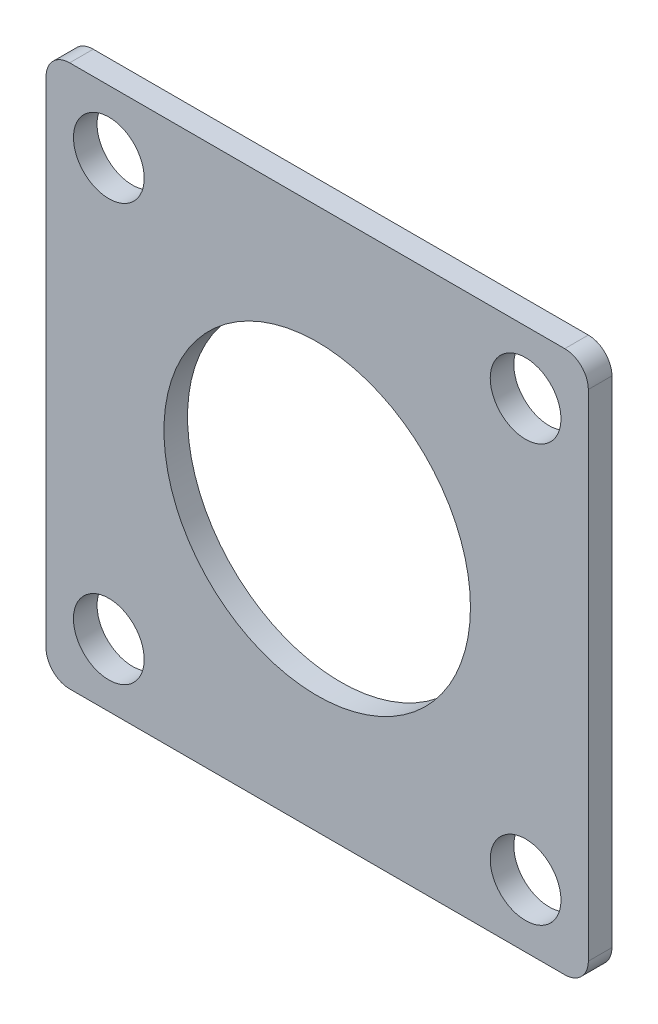
ISO-10303-21;
HEADER;
FILE_DESCRIPTION(('STEP AP214'),'2;1');
FILE_NAME('part.step','',(''),(''),'','','');
FILE_SCHEMA(('AUTOMOTIVE_DESIGN { 1 0 10303 214 1 1 1 1 }'));
ENDSEC;
DATA;
#1=APPLICATION_CONTEXT('core data for automotive mechanical design processes');
#2=APPLICATION_PROTOCOL_DEFINITION('international standard','automotive_design',2000,#1);
#3=PRODUCT_CONTEXT('',#1,'mechanical');
#4=PRODUCT('Part','Part','',(#3));
#5=PRODUCT_RELATED_PRODUCT_CATEGORY('part','',(#4));
#6=PRODUCT_DEFINITION_FORMATION('','',#4);
#7=PRODUCT_DEFINITION_CONTEXT('part definition',#1,'design');
#8=PRODUCT_DEFINITION('design','',#6,#7);
#9=PRODUCT_DEFINITION_SHAPE('','',#8);
#10=(LENGTH_UNIT() NAMED_UNIT(*) SI_UNIT(.MILLI.,.METRE.));
#11=(NAMED_UNIT(*) PLANE_ANGLE_UNIT() SI_UNIT($,.RADIAN.));
#12=(NAMED_UNIT(*) SI_UNIT($,.STERADIAN.) SOLID_ANGLE_UNIT());
#13=UNCERTAINTY_MEASURE_WITH_UNIT(LENGTH_MEASURE(1.E-05),#10,'distance_accuracy_value','');
#14=(GEOMETRIC_REPRESENTATION_CONTEXT(3) GLOBAL_UNCERTAINTY_ASSIGNED_CONTEXT((#13)) GLOBAL_UNIT_ASSIGNED_CONTEXT((#10,
#11,#12)) REPRESENTATION_CONTEXT('',''));
#15=CARTESIAN_POINT('',(0.,0.,0.));
#16=DIRECTION('',(0.,0.,1.));
#17=DIRECTION('',(1.,0.,0.));
#18=AXIS2_PLACEMENT_3D('',#15,#16,#17);
#19=CARTESIAN_POINT('',(-11.5,-11.5,1.));
#20=DIRECTION('',(0.,0.,1.));
#21=DIRECTION('',(1.,0.,0.));
#22=AXIS2_PLACEMENT_3D('',#19,#20,#21);
#23=PLANE('',#22);
#24=CARTESIAN_POINT('',(8.83883476483185,8.83883476483184,1.));
#25=DIRECTION('',(0.,0.,1.));
#26=DIRECTION('',(-1.,0.,0.));
#27=AXIS2_PLACEMENT_3D('',#24,#25,#26);
#28=CIRCLE('',#27,1.5);
#29=CARTESIAN_POINT('',(7.33883476483185,8.83883476483184,1.));
#30=VERTEX_POINT('',#29);
#31=EDGE_CURVE('E209',#30,#30,#28,.T.);
#32=ORIENTED_EDGE('',*,*,#31,.F.);
#33=EDGE_LOOP('',(#32));
#34=FACE_BOUND('',#33,.T.);
#35=CARTESIAN_POINT('',(-8.83883476483185,-8.83883476483184,1.));
#36=DIRECTION('',(0.,0.,1.));
#37=DIRECTION('',(-1.,0.,0.));
#38=AXIS2_PLACEMENT_3D('',#35,#36,#37);
#39=CIRCLE('',#38,1.5);
#40=CARTESIAN_POINT('',(-10.3388347648318,-8.83883476483184,1.));
#41=VERTEX_POINT('',#40);
#42=EDGE_CURVE('E226',#41,#41,#39,.T.);
#43=ORIENTED_EDGE('',*,*,#42,.F.);
#44=EDGE_LOOP('',(#43));
#45=FACE_BOUND('',#44,.T.);
#46=DIRECTION('',(0.,-1.,0.));
#47=VECTOR('',#46,1.);
#48=CARTESIAN_POINT('',(-11.5,11.5,1.));
#49=LINE('',#48,#47);
#50=CARTESIAN_POINT('',(-11.5,10.5,1.));
#51=VERTEX_POINT('',#50);
#52=CARTESIAN_POINT('',(-11.5,-10.5,1.));
#53=VERTEX_POINT('',#52);
#54=EDGE_CURVE('E165',#51,#53,#49,.T.);
#55=ORIENTED_EDGE('',*,*,#54,.T.);
#56=CARTESIAN_POINT('',(-10.5,-10.5,1.));
#57=DIRECTION('',(0.,0.,1.));
#58=DIRECTION('',(1.,0.,0.));
#59=AXIS2_PLACEMENT_3D('',#56,#57,#58);
#60=CIRCLE('',#59,1.);
#61=CARTESIAN_POINT('',(-10.5,-11.5,1.));
#62=VERTEX_POINT('',#61);
#63=EDGE_CURVE('E189',#53,#62,#60,.T.);
#64=ORIENTED_EDGE('',*,*,#63,.T.);
#65=DIRECTION('',(1.,0.,0.));
#66=VECTOR('',#65,1.);
#67=CARTESIAN_POINT('',(-11.5,-11.5,1.));
#68=LINE('',#67,#66);
#69=CARTESIAN_POINT('',(10.5,-11.5,1.));
#70=VERTEX_POINT('',#69);
#71=EDGE_CURVE('E140',#62,#70,#68,.T.);
#72=ORIENTED_EDGE('',*,*,#71,.T.);
#73=CARTESIAN_POINT('',(10.5,-10.5,1.));
#74=DIRECTION('',(0.,0.,1.));
#75=DIRECTION('',(1.,0.,0.));
#76=AXIS2_PLACEMENT_3D('',#73,#74,#75);
#77=CIRCLE('',#76,1.);
#78=CARTESIAN_POINT('',(11.5,-10.5,1.));
#79=VERTEX_POINT('',#78);
#80=EDGE_CURVE('E186',#70,#79,#77,.T.);
#81=ORIENTED_EDGE('',*,*,#80,.T.);
#82=DIRECTION('',(0.,1.,0.));
#83=VECTOR('',#82,1.);
#84=CARTESIAN_POINT('',(11.5,11.5,1.));
#85=LINE('',#84,#83);
#86=CARTESIAN_POINT('',(11.5,10.5,1.));
#87=VERTEX_POINT('',#86);
#88=EDGE_CURVE('E203',#79,#87,#85,.T.);
#89=ORIENTED_EDGE('',*,*,#88,.T.);
#90=CARTESIAN_POINT('',(10.5,10.5,1.));
#91=DIRECTION('',(0.,0.,1.));
#92=DIRECTION('',(1.,0.,0.));
#93=AXIS2_PLACEMENT_3D('',#90,#91,#92);
#94=CIRCLE('',#93,1.);
#95=CARTESIAN_POINT('',(10.5,11.5,1.));
#96=VERTEX_POINT('',#95);
#97=EDGE_CURVE('E63',#87,#96,#94,.T.);
#98=ORIENTED_EDGE('',*,*,#97,.T.);
#99=DIRECTION('',(-1.,0.,0.));
#100=VECTOR('',#99,1.);
#101=CARTESIAN_POINT('',(-11.5,11.5,1.));
#102=LINE('',#101,#100);
#103=CARTESIAN_POINT('',(-10.5,11.5,1.));
#104=VERTEX_POINT('',#103);
#105=EDGE_CURVE('E167',#96,#104,#102,.T.);
#106=ORIENTED_EDGE('',*,*,#105,.T.);
#107=CARTESIAN_POINT('',(-10.5,10.5,1.));
#108=DIRECTION('',(0.,0.,1.));
#109=DIRECTION('',(1.,0.,0.));
#110=AXIS2_PLACEMENT_3D('',#107,#108,#109);
#111=CIRCLE('',#110,1.);
#112=EDGE_CURVE('E181',#104,#51,#111,.T.);
#113=ORIENTED_EDGE('',*,*,#112,.T.);
#114=EDGE_LOOP('',(#55,#64,#72,#81,#89,#98,#106,#113));
#115=FACE_BOUND('',#114,.T.);
#116=CARTESIAN_POINT('',(-8.83883476483185,8.83883476483184,1.));
#117=DIRECTION('',(0.,0.,1.));
#118=DIRECTION('',(1.,0.,0.));
#119=AXIS2_PLACEMENT_3D('',#116,#117,#118);
#120=CIRCLE('',#119,1.5);
#121=CARTESIAN_POINT('',(-7.33883476483185,8.83883476483184,1.));
#122=VERTEX_POINT('',#121);
#123=EDGE_CURVE('E159',#122,#122,#120,.T.);
#124=ORIENTED_EDGE('',*,*,#123,.F.);
#125=EDGE_LOOP('',(#124));
#126=FACE_BOUND('',#125,.T.);
#127=CARTESIAN_POINT('',(8.83883476483185,-8.83883476483184,1.));
#128=DIRECTION('',(0.,0.,1.));
#129=DIRECTION('',(1.,0.,0.));
#130=AXIS2_PLACEMENT_3D('',#127,#128,#129);
#131=CIRCLE('',#130,1.5);
#132=CARTESIAN_POINT('',(10.3388347648318,-8.83883476483184,1.));
#133=VERTEX_POINT('',#132);
#134=EDGE_CURVE('E200',#133,#133,#131,.T.);
#135=ORIENTED_EDGE('',*,*,#134,.F.);
#136=EDGE_LOOP('',(#135));
#137=FACE_BOUND('',#136,.T.);
#138=CARTESIAN_POINT('',(0.,0.,1.));
#139=DIRECTION('',(0.,0.,1.));
#140=DIRECTION('',(1.,0.,0.));
#141=AXIS2_PLACEMENT_3D('',#138,#139,#140);
#142=CIRCLE('',#141,6.5);
#143=CARTESIAN_POINT('',(6.5,0.,1.));
#144=VERTEX_POINT('',#143);
#145=EDGE_CURVE('E210',#144,#144,#142,.T.);
#146=ORIENTED_EDGE('',*,*,#145,.F.);
#147=EDGE_LOOP('',(#146));
#148=FACE_BOUND('',#147,.T.);
#149=ADVANCED_FACE('F36',(#34,#45,#115,#126,#137,#148),#23,.T.);
#150=CARTESIAN_POINT('',(-11.5,-11.5,0.));
#151=DIRECTION('',(0.,0.,1.));
#152=DIRECTION('',(1.,0.,0.));
#153=AXIS2_PLACEMENT_3D('',#150,#151,#152);
#154=PLANE('',#153);
#155=CARTESIAN_POINT('',(8.83883476483185,8.83883476483184,0.));
#156=DIRECTION('',(0.,0.,1.));
#157=DIRECTION('',(-1.,0.,0.));
#158=AXIS2_PLACEMENT_3D('',#155,#156,#157);
#159=CIRCLE('',#158,1.5);
#160=CARTESIAN_POINT('',(7.33883476483185,8.83883476483184,0.));
#161=VERTEX_POINT('',#160);
#162=EDGE_CURVE('E206',#161,#161,#159,.T.);
#163=ORIENTED_EDGE('',*,*,#162,.T.);
#164=EDGE_LOOP('',(#163));
#165=FACE_BOUND('',#164,.T.);
#166=CARTESIAN_POINT('',(-8.83883476483185,-8.83883476483184,0.));
#167=DIRECTION('',(0.,0.,1.));
#168=DIRECTION('',(-1.,0.,0.));
#169=AXIS2_PLACEMENT_3D('',#166,#167,#168);
#170=CIRCLE('',#169,1.5);
#171=CARTESIAN_POINT('',(-10.3388347648318,-8.83883476483184,0.));
#172=VERTEX_POINT('',#171);
#173=EDGE_CURVE('E224',#172,#172,#170,.T.);
#174=ORIENTED_EDGE('',*,*,#173,.T.);
#175=EDGE_LOOP('',(#174));
#176=FACE_BOUND('',#175,.T.);
#177=DIRECTION('',(1.,0.,0.));
#178=VECTOR('',#177,1.);
#179=CARTESIAN_POINT('',(-11.5,-11.5,0.));
#180=LINE('',#179,#178);
#181=CARTESIAN_POINT('',(-10.5,-11.5,0.));
#182=VERTEX_POINT('',#181);
#183=CARTESIAN_POINT('',(10.5,-11.5,0.));
#184=VERTEX_POINT('',#183);
#185=EDGE_CURVE('E137',#182,#184,#180,.T.);
#186=ORIENTED_EDGE('',*,*,#185,.F.);
#187=CARTESIAN_POINT('',(-10.5,-10.5,0.));
#188=DIRECTION('',(0.,0.,1.));
#189=DIRECTION('',(1.,0.,0.));
#190=AXIS2_PLACEMENT_3D('',#187,#188,#189);
#191=CIRCLE('',#190,1.);
#192=CARTESIAN_POINT('',(-11.5,-10.5,0.));
#193=VERTEX_POINT('',#192);
#194=EDGE_CURVE('E119',#182,#193,#191,.F.);
#195=ORIENTED_EDGE('',*,*,#194,.T.);
#196=DIRECTION('',(0.,-1.,0.));
#197=VECTOR('',#196,1.);
#198=CARTESIAN_POINT('',(-11.5,11.5,0.));
#199=LINE('',#198,#197);
#200=CARTESIAN_POINT('',(-11.5,10.5,0.));
#201=VERTEX_POINT('',#200);
#202=EDGE_CURVE('E150',#201,#193,#199,.T.);
#203=ORIENTED_EDGE('',*,*,#202,.F.);
#204=CARTESIAN_POINT('',(-10.5,10.5,0.));
#205=DIRECTION('',(0.,0.,1.));
#206=DIRECTION('',(1.,0.,0.));
#207=AXIS2_PLACEMENT_3D('',#204,#205,#206);
#208=CIRCLE('',#207,1.);
#209=CARTESIAN_POINT('',(-10.5,11.5,0.));
#210=VERTEX_POINT('',#209);
#211=EDGE_CURVE('E142',#201,#210,#208,.F.);
#212=ORIENTED_EDGE('',*,*,#211,.T.);
#213=DIRECTION('',(-1.,0.,0.));
#214=VECTOR('',#213,1.);
#215=CARTESIAN_POINT('',(-11.5,11.5,0.));
#216=LINE('',#215,#214);
#217=CARTESIAN_POINT('',(10.5,11.5,0.));
#218=VERTEX_POINT('',#217);
#219=EDGE_CURVE('E156',#218,#210,#216,.T.);
#220=ORIENTED_EDGE('',*,*,#219,.F.);
#221=CARTESIAN_POINT('',(10.5,10.5,0.));
#222=DIRECTION('',(0.,0.,1.));
#223=DIRECTION('',(1.,0.,0.));
#224=AXIS2_PLACEMENT_3D('',#221,#222,#223);
#225=CIRCLE('',#224,1.);
#226=CARTESIAN_POINT('',(11.5,10.5,0.));
#227=VERTEX_POINT('',#226);
#228=EDGE_CURVE('E171',#218,#227,#225,.F.);
#229=ORIENTED_EDGE('',*,*,#228,.T.);
#230=DIRECTION('',(0.,1.,0.));
#231=VECTOR('',#230,1.);
#232=CARTESIAN_POINT('',(11.5,11.5,0.));
#233=LINE('',#232,#231);
#234=CARTESIAN_POINT('',(11.5,-10.5,0.));
#235=VERTEX_POINT('',#234);
#236=EDGE_CURVE('E149',#235,#227,#233,.T.);
#237=ORIENTED_EDGE('',*,*,#236,.F.);
#238=CARTESIAN_POINT('',(10.5,-10.5,0.));
#239=DIRECTION('',(0.,0.,1.));
#240=DIRECTION('',(1.,0.,0.));
#241=AXIS2_PLACEMENT_3D('',#238,#239,#240);
#242=CIRCLE('',#241,1.);
#243=EDGE_CURVE('E131',#235,#184,#242,.F.);
#244=ORIENTED_EDGE('',*,*,#243,.T.);
#245=EDGE_LOOP('',(#186,#195,#203,#212,#220,#229,#237,#244));
#246=FACE_BOUND('',#245,.T.);
#247=CARTESIAN_POINT('',(-8.83883476483185,8.83883476483184,0.));
#248=DIRECTION('',(0.,0.,1.));
#249=DIRECTION('',(1.,0.,0.));
#250=AXIS2_PLACEMENT_3D('',#247,#248,#249);
#251=CIRCLE('',#250,1.5);
#252=CARTESIAN_POINT('',(-7.33883476483185,8.83883476483184,0.));
#253=VERTEX_POINT('',#252);
#254=EDGE_CURVE('E230',#253,#253,#251,.T.);
#255=ORIENTED_EDGE('',*,*,#254,.T.);
#256=EDGE_LOOP('',(#255));
#257=FACE_BOUND('',#256,.T.);
#258=CARTESIAN_POINT('',(8.83883476483185,-8.83883476483184,0.));
#259=DIRECTION('',(0.,0.,1.));
#260=DIRECTION('',(1.,0.,0.));
#261=AXIS2_PLACEMENT_3D('',#258,#259,#260);
#262=CIRCLE('',#261,1.5);
#263=CARTESIAN_POINT('',(10.3388347648318,-8.83883476483184,0.));
#264=VERTEX_POINT('',#263);
#265=EDGE_CURVE('E213',#264,#264,#262,.T.);
#266=ORIENTED_EDGE('',*,*,#265,.T.);
#267=EDGE_LOOP('',(#266));
#268=FACE_BOUND('',#267,.T.);
#269=CARTESIAN_POINT('',(0.,0.,0.));
#270=DIRECTION('',(0.,0.,1.));
#271=DIRECTION('',(1.,0.,0.));
#272=AXIS2_PLACEMENT_3D('',#269,#270,#271);
#273=CIRCLE('',#272,6.5);
#274=CARTESIAN_POINT('',(6.5,0.,0.));
#275=VERTEX_POINT('',#274);
#276=EDGE_CURVE('E220',#275,#275,#273,.T.);
#277=ORIENTED_EDGE('',*,*,#276,.T.);
#278=EDGE_LOOP('',(#277));
#279=FACE_BOUND('',#278,.T.);
#280=ADVANCED_FACE('F145',(#165,#176,#246,#257,#268,#279),#154,.F.);
#281=CARTESIAN_POINT('',(-11.5,11.5,1.));
#282=DIRECTION('',(1.,0.,0.));
#283=DIRECTION('',(0.,0.,-1.));
#284=AXIS2_PLACEMENT_3D('',#281,#282,#283);
#285=PLANE('',#284);
#286=ORIENTED_EDGE('',*,*,#202,.T.);
#287=DIRECTION('',(0.,0.,-1.));
#288=VECTOR('',#287,1.);
#289=CARTESIAN_POINT('',(-11.5,-10.5,1.));
#290=LINE('',#289,#288);
#291=EDGE_CURVE('E124',#193,#53,#290,.F.);
#292=ORIENTED_EDGE('',*,*,#291,.T.);
#293=ORIENTED_EDGE('',*,*,#54,.F.);
#294=DIRECTION('',(0.,0.,-1.));
#295=VECTOR('',#294,1.);
#296=CARTESIAN_POINT('',(-11.5,10.5,1.));
#297=LINE('',#296,#295);
#298=EDGE_CURVE('E130',#51,#201,#297,.T.);
#299=ORIENTED_EDGE('',*,*,#298,.T.);
#300=EDGE_LOOP('',(#286,#292,#293,#299));
#301=FACE_BOUND('',#300,.T.);
#302=ADVANCED_FACE('F251',(#301),#285,.F.);
#303=CARTESIAN_POINT('',(-11.5,-11.5,1.));
#304=DIRECTION('',(0.,1.,0.));
#305=DIRECTION('',(0.,0.,1.));
#306=AXIS2_PLACEMENT_3D('',#303,#304,#305);
#307=PLANE('',#306);
#308=ORIENTED_EDGE('',*,*,#71,.F.);
#309=DIRECTION('',(0.,0.,-1.));
#310=VECTOR('',#309,1.);
#311=CARTESIAN_POINT('',(-10.5,-11.5,1.));
#312=LINE('',#311,#310);
#313=EDGE_CURVE('E123',#62,#182,#312,.T.);
#314=ORIENTED_EDGE('',*,*,#313,.T.);
#315=ORIENTED_EDGE('',*,*,#185,.T.);
#316=DIRECTION('',(0.,0.,-1.));
#317=VECTOR('',#316,1.);
#318=CARTESIAN_POINT('',(10.5,-11.5,1.));
#319=LINE('',#318,#317);
#320=EDGE_CURVE('E143',#184,#70,#319,.F.);
#321=ORIENTED_EDGE('',*,*,#320,.T.);
#322=EDGE_LOOP('',(#308,#314,#315,#321));
#323=FACE_BOUND('',#322,.T.);
#324=ADVANCED_FACE('F136',(#323),#307,.F.);
#325=CARTESIAN_POINT('',(11.5,11.5,1.));
#326=DIRECTION('',(-1.,0.,0.));
#327=DIRECTION('',(0.,0.,1.));
#328=AXIS2_PLACEMENT_3D('',#325,#326,#327);
#329=PLANE('',#328);
#330=ORIENTED_EDGE('',*,*,#88,.F.);
#331=DIRECTION('',(0.,0.,-1.));
#332=VECTOR('',#331,1.);
#333=CARTESIAN_POINT('',(11.5,-10.5,1.));
#334=LINE('',#333,#332);
#335=EDGE_CURVE('E195',#79,#235,#334,.T.);
#336=ORIENTED_EDGE('',*,*,#335,.T.);
#337=ORIENTED_EDGE('',*,*,#236,.T.);
#338=DIRECTION('',(0.,0.,-1.));
#339=VECTOR('',#338,1.);
#340=CARTESIAN_POINT('',(11.5,10.5,1.));
#341=LINE('',#340,#339);
#342=EDGE_CURVE('E192',#227,#87,#341,.F.);
#343=ORIENTED_EDGE('',*,*,#342,.T.);
#344=EDGE_LOOP('',(#330,#336,#337,#343));
#345=FACE_BOUND('',#344,.T.);
#346=ADVANCED_FACE('F259',(#345),#329,.F.);
#347=CARTESIAN_POINT('',(-11.5,11.5,1.));
#348=DIRECTION('',(0.,-1.,0.));
#349=DIRECTION('',(0.,0.,-1.));
#350=AXIS2_PLACEMENT_3D('',#347,#348,#349);
#351=PLANE('',#350);
#352=ORIENTED_EDGE('',*,*,#105,.F.);
#353=DIRECTION('',(0.,0.,-1.));
#354=VECTOR('',#353,1.);
#355=CARTESIAN_POINT('',(10.5,11.5,1.));
#356=LINE('',#355,#354);
#357=EDGE_CURVE('E11',#96,#218,#356,.T.);
#358=ORIENTED_EDGE('',*,*,#357,.T.);
#359=ORIENTED_EDGE('',*,*,#219,.T.);
#360=DIRECTION('',(0.,0.,-1.));
#361=VECTOR('',#360,1.);
#362=CARTESIAN_POINT('',(-10.5,11.5,1.));
#363=LINE('',#362,#361);
#364=EDGE_CURVE('E45',#210,#104,#363,.F.);
#365=ORIENTED_EDGE('',*,*,#364,.T.);
#366=EDGE_LOOP('',(#352,#358,#359,#365));
#367=FACE_BOUND('',#366,.T.);
#368=ADVANCED_FACE('F253',(#367),#351,.F.);
#369=CARTESIAN_POINT('',(-8.83883476483185,8.83883476483184,1.));
#370=DIRECTION('',(0.,0.,-1.));
#371=DIRECTION('',(-1.,0.,0.));
#372=AXIS2_PLACEMENT_3D('',#369,#370,#371);
#373=CYLINDRICAL_SURFACE('',#372,1.5);
#374=ORIENTED_EDGE('',*,*,#123,.T.);
#375=EDGE_LOOP('',(#374));
#376=FACE_BOUND('',#375,.T.);
#377=ORIENTED_EDGE('',*,*,#254,.F.);
#378=EDGE_LOOP('',(#377));
#379=FACE_BOUND('',#378,.T.);
#380=ADVANCED_FACE('F282',(#376,#379),#373,.F.);
#381=CARTESIAN_POINT('',(-8.83883476483185,-8.83883476483184,1.));
#382=DIRECTION('',(0.,0.,-1.));
#383=DIRECTION('',(-1.,0.,0.));
#384=AXIS2_PLACEMENT_3D('',#381,#382,#383);
#385=CYLINDRICAL_SURFACE('',#384,1.5);
#386=ORIENTED_EDGE('',*,*,#42,.T.);
#387=EDGE_LOOP('',(#386));
#388=FACE_BOUND('',#387,.T.);
#389=ORIENTED_EDGE('',*,*,#173,.F.);
#390=EDGE_LOOP('',(#389));
#391=FACE_BOUND('',#390,.T.);
#392=ADVANCED_FACE('F315',(#388,#391),#385,.F.);
#393=CARTESIAN_POINT('',(8.83883476483185,-8.83883476483184,1.));
#394=DIRECTION('',(0.,0.,-1.));
#395=DIRECTION('',(-1.,0.,0.));
#396=AXIS2_PLACEMENT_3D('',#393,#394,#395);
#397=CYLINDRICAL_SURFACE('',#396,1.5);
#398=ORIENTED_EDGE('',*,*,#134,.T.);
#399=EDGE_LOOP('',(#398));
#400=FACE_BOUND('',#399,.T.);
#401=ORIENTED_EDGE('',*,*,#265,.F.);
#402=EDGE_LOOP('',(#401));
#403=FACE_BOUND('',#402,.T.);
#404=ADVANCED_FACE('F322',(#400,#403),#397,.F.);
#405=CARTESIAN_POINT('',(8.83883476483185,8.83883476483184,1.));
#406=DIRECTION('',(0.,0.,-1.));
#407=DIRECTION('',(-1.,0.,0.));
#408=AXIS2_PLACEMENT_3D('',#405,#406,#407);
#409=CYLINDRICAL_SURFACE('',#408,1.5);
#410=ORIENTED_EDGE('',*,*,#31,.T.);
#411=EDGE_LOOP('',(#410));
#412=FACE_BOUND('',#411,.T.);
#413=ORIENTED_EDGE('',*,*,#162,.F.);
#414=EDGE_LOOP('',(#413));
#415=FACE_BOUND('',#414,.T.);
#416=ADVANCED_FACE('F329',(#412,#415),#409,.F.);
#417=CARTESIAN_POINT('',(0.,0.,1.));
#418=DIRECTION('',(0.,0.,-1.));
#419=DIRECTION('',(-1.,0.,0.));
#420=AXIS2_PLACEMENT_3D('',#417,#418,#419);
#421=CYLINDRICAL_SURFACE('',#420,6.5);
#422=ORIENTED_EDGE('',*,*,#145,.T.);
#423=EDGE_LOOP('',(#422));
#424=FACE_BOUND('',#423,.T.);
#425=ORIENTED_EDGE('',*,*,#276,.F.);
#426=EDGE_LOOP('',(#425));
#427=FACE_BOUND('',#426,.T.);
#428=ADVANCED_FACE('F270',(#424,#427),#421,.F.);
#429=CARTESIAN_POINT('',(-10.5,-10.5,1.));
#430=DIRECTION('',(0.,0.,-1.));
#431=DIRECTION('',(-1.,0.,0.));
#432=AXIS2_PLACEMENT_3D('',#429,#430,#431);
#433=CYLINDRICAL_SURFACE('',#432,1.);
#434=ORIENTED_EDGE('',*,*,#63,.F.);
#435=ORIENTED_EDGE('',*,*,#291,.F.);
#436=ORIENTED_EDGE('',*,*,#194,.F.);
#437=ORIENTED_EDGE('',*,*,#313,.F.);
#438=EDGE_LOOP('',(#434,#435,#436,#437));
#439=FACE_BOUND('',#438,.T.);
#440=ADVANCED_FACE('F122',(#439),#433,.T.);
#441=CARTESIAN_POINT('',(10.5,-10.5,1.));
#442=DIRECTION('',(0.,0.,-1.));
#443=DIRECTION('',(-1.,0.,0.));
#444=AXIS2_PLACEMENT_3D('',#441,#442,#443);
#445=CYLINDRICAL_SURFACE('',#444,1.);
#446=ORIENTED_EDGE('',*,*,#80,.F.);
#447=ORIENTED_EDGE('',*,*,#320,.F.);
#448=ORIENTED_EDGE('',*,*,#243,.F.);
#449=ORIENTED_EDGE('',*,*,#335,.F.);
#450=EDGE_LOOP('',(#446,#447,#448,#449));
#451=FACE_BOUND('',#450,.T.);
#452=ADVANCED_FACE('F263',(#451),#445,.T.);
#453=CARTESIAN_POINT('',(10.5,10.5,1.));
#454=DIRECTION('',(0.,0.,-1.));
#455=DIRECTION('',(-1.,0.,0.));
#456=AXIS2_PLACEMENT_3D('',#453,#454,#455);
#457=CYLINDRICAL_SURFACE('',#456,1.);
#458=ORIENTED_EDGE('',*,*,#97,.F.);
#459=ORIENTED_EDGE('',*,*,#342,.F.);
#460=ORIENTED_EDGE('',*,*,#228,.F.);
#461=ORIENTED_EDGE('',*,*,#357,.F.);
#462=EDGE_LOOP('',(#458,#459,#460,#461));
#463=FACE_BOUND('',#462,.T.);
#464=ADVANCED_FACE('F255',(#463),#457,.T.);
#465=CARTESIAN_POINT('',(-10.5,10.5,1.));
#466=DIRECTION('',(0.,0.,-1.));
#467=DIRECTION('',(-1.,0.,0.));
#468=AXIS2_PLACEMENT_3D('',#465,#466,#467);
#469=CYLINDRICAL_SURFACE('',#468,1.);
#470=ORIENTED_EDGE('',*,*,#112,.F.);
#471=ORIENTED_EDGE('',*,*,#364,.F.);
#472=ORIENTED_EDGE('',*,*,#211,.F.);
#473=ORIENTED_EDGE('',*,*,#298,.F.);
#474=EDGE_LOOP('',(#470,#471,#472,#473));
#475=FACE_BOUND('',#474,.T.);
#476=ADVANCED_FACE('F38',(#475),#469,.T.);
#477=CLOSED_SHELL('',(#149,#280,#302,#324,#346,#368,#380,#392,#404,#416,#428,#440,#452,#464,#476));
#478=MANIFOLD_SOLID_BREP('B2',#477);
#479=ADVANCED_BREP_SHAPE_REPRESENTATION('',(#18,#478),#14);
#480=SHAPE_DEFINITION_REPRESENTATION(#9,#479);
ENDSEC;
END-ISO-10303-21;
